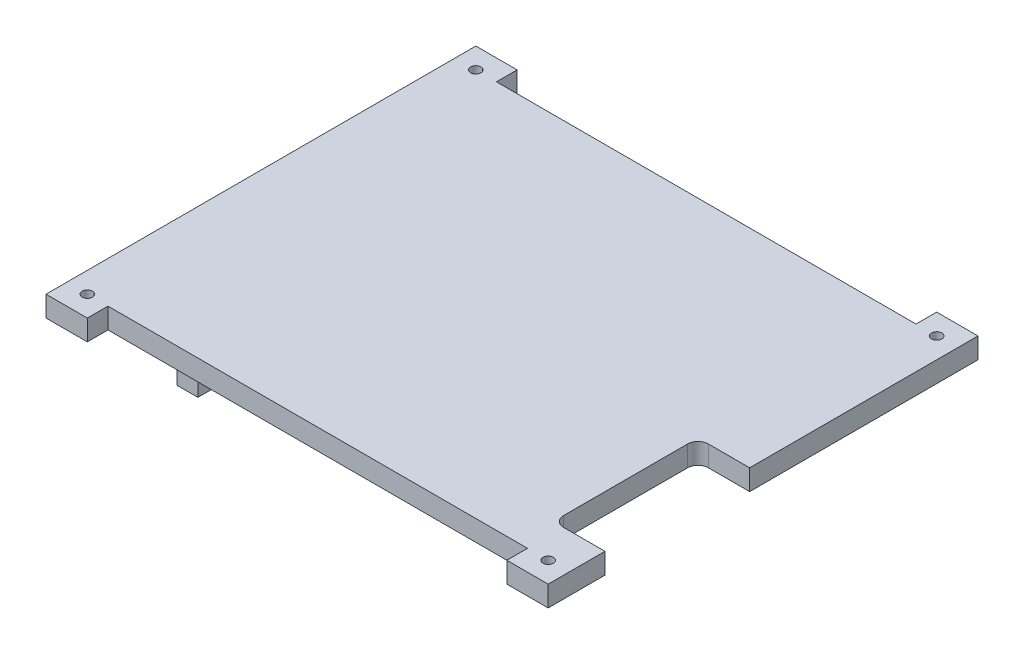
ISO-10303-21;
HEADER;
FILE_DESCRIPTION(('STEP AP214'),'2;1');
FILE_NAME('part.step','',(''),(''),'','','');
FILE_SCHEMA(('AUTOMOTIVE_DESIGN { 1 0 10303 214 1 1 1 1 }'));
ENDSEC;
DATA;
#1=APPLICATION_CONTEXT('core data for automotive mechanical design processes');
#2=APPLICATION_PROTOCOL_DEFINITION('international standard','automotive_design',2000,#1);
#3=PRODUCT_CONTEXT('',#1,'mechanical');
#4=PRODUCT('Part','Part','',(#3));
#5=PRODUCT_RELATED_PRODUCT_CATEGORY('part','',(#4));
#6=PRODUCT_DEFINITION_FORMATION('','',#4);
#7=PRODUCT_DEFINITION_CONTEXT('part definition',#1,'design');
#8=PRODUCT_DEFINITION('design','',#6,#7);
#9=PRODUCT_DEFINITION_SHAPE('','',#8);
#10=(LENGTH_UNIT() NAMED_UNIT(*) SI_UNIT(.MILLI.,.METRE.));
#11=(NAMED_UNIT(*) PLANE_ANGLE_UNIT() SI_UNIT($,.RADIAN.));
#12=(NAMED_UNIT(*) SI_UNIT($,.STERADIAN.) SOLID_ANGLE_UNIT());
#13=UNCERTAINTY_MEASURE_WITH_UNIT(LENGTH_MEASURE(1.E-05),#10,'distance_accuracy_value','');
#14=(GEOMETRIC_REPRESENTATION_CONTEXT(3) GLOBAL_UNCERTAINTY_ASSIGNED_CONTEXT((#13)) GLOBAL_UNIT_ASSIGNED_CONTEXT((#10,
#11,#12)) REPRESENTATION_CONTEXT('',''));
#15=CARTESIAN_POINT('',(0.,0.,0.));
#16=DIRECTION('',(0.,0.,1.));
#17=DIRECTION('',(1.,0.,0.));
#18=AXIS2_PLACEMENT_3D('',#15,#16,#17);
#19=CARTESIAN_POINT('',(0.,-1346.90837694455,0.));
#20=DIRECTION('',(0.,1.,0.));
#21=DIRECTION('',(0.,0.,1.));
#22=AXIS2_PLACEMENT_3D('',#19,#20,#21);
#23=PLANE('',#22);
#24=CARTESIAN_POINT('',(-1070.43227351419,-1346.90837694455,-1964.4));
#25=DIRECTION('',(0.,1.,0.));
#26=DIRECTION('',(0.,0.,1.));
#27=AXIS2_PLACEMENT_3D('',#24,#25,#26);
#28=CIRCLE('',#27,0.499999999999993);
#29=CARTESIAN_POINT('',(-1070.43227351419,-1346.90837694455,-1963.9));
#30=VERTEX_POINT('',#29);
#31=EDGE_CURVE('E241',#30,#30,#28,.T.);
#32=ORIENTED_EDGE('',*,*,#31,.T.);
#33=EDGE_LOOP('',(#32));
#34=FACE_BOUND('',#33,.T.);
#35=CARTESIAN_POINT('',(-1025.83227351419,-1346.90837694455,-1964.4));
#36=DIRECTION('',(0.,1.,0.));
#37=DIRECTION('',(0.,0.,1.));
#38=AXIS2_PLACEMENT_3D('',#35,#36,#37);
#39=CIRCLE('',#38,0.499999999999993);
#40=CARTESIAN_POINT('',(-1025.83227351419,-1346.90837694455,-1963.9));
#41=VERTEX_POINT('',#40);
#42=EDGE_CURVE('E310',#41,#41,#39,.T.);
#43=ORIENTED_EDGE('',*,*,#42,.T.);
#44=EDGE_LOOP('',(#43));
#45=FACE_BOUND('',#44,.T.);
#46=CARTESIAN_POINT('',(-1025.83227351419,-1346.90837694455,-2002.));
#47=DIRECTION('',(0.,1.,0.));
#48=DIRECTION('',(0.,0.,1.));
#49=AXIS2_PLACEMENT_3D('',#46,#47,#48);
#50=CIRCLE('',#49,0.499999999999999);
#51=CARTESIAN_POINT('',(-1025.83227351419,-1346.90837694455,-2001.5));
#52=VERTEX_POINT('',#51);
#53=EDGE_CURVE('E307',#52,#52,#50,.F.);
#54=ORIENTED_EDGE('',*,*,#53,.F.);
#55=EDGE_LOOP('',(#54));
#56=FACE_BOUND('',#55,.T.);
#57=CARTESIAN_POINT('',(-1070.43227351419,-1346.90837694455,-2002.));
#58=DIRECTION('',(0.,1.,0.));
#59=DIRECTION('',(0.,0.,1.));
#60=AXIS2_PLACEMENT_3D('',#57,#58,#59);
#61=CIRCLE('',#60,0.5);
#62=CARTESIAN_POINT('',(-1070.43227351419,-1346.90837694455,-2001.5));
#63=VERTEX_POINT('',#62);
#64=EDGE_CURVE('E304',#63,#63,#61,.F.);
#65=ORIENTED_EDGE('',*,*,#64,.F.);
#66=EDGE_LOOP('',(#65));
#67=FACE_BOUND('',#66,.T.);
#68=DIRECTION('',(-1.,0.,0.));
#69=VECTOR('',#68,1.);
#70=CARTESIAN_POINT('',(-1072.43227351419,-1346.90837694455,-1975.1));
#71=LINE('',#70,#69);
#72=CARTESIAN_POINT('',(-1070.43227351419,-1346.90837694455,-1975.1));
#73=VERTEX_POINT('',#72);
#74=CARTESIAN_POINT('',(-1072.43227351419,-1346.90837694455,-1975.1));
#75=VERTEX_POINT('',#74);
#76=EDGE_CURVE('E49',#73,#75,#71,.T.);
#77=ORIENTED_EDGE('',*,*,#76,.F.);
#78=DIRECTION('',(0.,0.,1.));
#79=VECTOR('',#78,1.);
#80=CARTESIAN_POINT('',(-1070.43227351419,-1346.90837694455,-1991.3));
#81=LINE('',#80,#79);
#82=CARTESIAN_POINT('',(-1070.43227351419,-1346.90837694455,-1991.3));
#83=VERTEX_POINT('',#82);
#84=EDGE_CURVE('E179',#83,#73,#81,.T.);
#85=ORIENTED_EDGE('',*,*,#84,.F.);
#86=DIRECTION('',(1.,0.,0.));
#87=VECTOR('',#86,1.);
#88=CARTESIAN_POINT('',(-1072.43227351419,-1346.90837694455,-1991.3));
#89=LINE('',#88,#87);
#90=CARTESIAN_POINT('',(-1072.43227351419,-1346.90837694455,-1991.3));
#91=VERTEX_POINT('',#90);
#92=EDGE_CURVE('E183',#91,#83,#89,.T.);
#93=ORIENTED_EDGE('',*,*,#92,.F.);
#94=DIRECTION('',(0.,0.,1.));
#95=VECTOR('',#94,1.);
#96=CARTESIAN_POINT('',(-1072.43227351419,-1346.90837694455,0.));
#97=LINE('',#96,#95);
#98=CARTESIAN_POINT('',(-1072.43227351419,-1346.90837694455,-2004.));
#99=VERTEX_POINT('',#98);
#100=EDGE_CURVE('E278',#99,#91,#97,.T.);
#101=ORIENTED_EDGE('',*,*,#100,.F.);
#102=DIRECTION('',(-1.,0.,0.));
#103=VECTOR('',#102,1.);
#104=CARTESIAN_POINT('',(0.,-1346.90837694455,-2004.));
#105=LINE('',#104,#103);
#106=CARTESIAN_POINT('',(-1068.43227351419,-1346.90837694455,-2004.));
#107=VERTEX_POINT('',#106);
#108=EDGE_CURVE('E302',#107,#99,#105,.T.);
#109=ORIENTED_EDGE('',*,*,#108,.F.);
#110=DIRECTION('',(0.,0.,-1.));
#111=VECTOR('',#110,1.);
#112=CARTESIAN_POINT('',(-1068.43227351419,-1346.90837694455,0.));
#113=LINE('',#112,#111);
#114=CARTESIAN_POINT('',(-1068.43227351419,-1346.90837694455,-2002.));
#115=VERTEX_POINT('',#114);
#116=EDGE_CURVE('E300',#115,#107,#113,.T.);
#117=ORIENTED_EDGE('',*,*,#116,.F.);
#118=DIRECTION('',(-1.,0.,0.));
#119=VECTOR('',#118,1.);
#120=CARTESIAN_POINT('',(0.,-1346.90837694455,-2002.));
#121=LINE('',#120,#119);
#122=CARTESIAN_POINT('',(-1027.83227351419,-1346.90837694455,-2002.));
#123=VERTEX_POINT('',#122);
#124=EDGE_CURVE('E298',#123,#115,#121,.T.);
#125=ORIENTED_EDGE('',*,*,#124,.F.);
#126=DIRECTION('',(0.,0.,1.));
#127=VECTOR('',#126,1.);
#128=CARTESIAN_POINT('',(-1027.83227351419,-1346.90837694455,0.));
#129=LINE('',#128,#127);
#130=CARTESIAN_POINT('',(-1027.83227351419,-1346.90837694455,-2004.));
#131=VERTEX_POINT('',#130);
#132=EDGE_CURVE('E296',#131,#123,#129,.T.);
#133=ORIENTED_EDGE('',*,*,#132,.F.);
#134=DIRECTION('',(-1.,0.,0.));
#135=VECTOR('',#134,1.);
#136=CARTESIAN_POINT('',(0.,-1346.90837694455,-2004.));
#137=LINE('',#136,#135);
#138=CARTESIAN_POINT('',(-1023.83227351419,-1346.90837694455,-2004.));
#139=VERTEX_POINT('',#138);
#140=EDGE_CURVE('E294',#139,#131,#137,.T.);
#141=ORIENTED_EDGE('',*,*,#140,.F.);
#142=DIRECTION('',(0.,0.,-1.));
#143=VECTOR('',#142,1.);
#144=CARTESIAN_POINT('',(-1023.83227351419,-1346.90837694455,0.));
#145=LINE('',#144,#143);
#146=CARTESIAN_POINT('',(-1023.83227351419,-1346.90837694455,-1981.9));
#147=VERTEX_POINT('',#146);
#148=EDGE_CURVE('E290',#147,#139,#145,.T.);
#149=ORIENTED_EDGE('',*,*,#148,.F.);
#150=DIRECTION('',(-1.,0.,0.));
#151=VECTOR('',#150,1.);
#152=CARTESIAN_POINT('',(0.,-1346.90837694455,-1981.9));
#153=LINE('',#152,#151);
#154=CARTESIAN_POINT('',(-1027.83227351419,-1346.90837694455,-1981.9));
#155=VERTEX_POINT('',#154);
#156=EDGE_CURVE('E221',#147,#155,#153,.T.);
#157=ORIENTED_EDGE('',*,*,#156,.T.);
#158=CARTESIAN_POINT('',(-1027.83227351419,-1346.90837694455,-1980.9));
#159=DIRECTION('',(0.,1.,0.));
#160=DIRECTION('',(0.,0.,1.));
#161=AXIS2_PLACEMENT_3D('',#158,#159,#160);
#162=CIRCLE('',#161,1.);
#163=CARTESIAN_POINT('',(-1028.83227351419,-1346.90837694455,-1980.9));
#164=VERTEX_POINT('',#163);
#165=EDGE_CURVE('E362',#155,#164,#162,.T.);
#166=ORIENTED_EDGE('',*,*,#165,.T.);
#167=DIRECTION('',(0.,0.,-1.));
#168=VECTOR('',#167,1.);
#169=CARTESIAN_POINT('',(-1028.83227351419,-1346.90837694455,0.));
#170=LINE('',#169,#168);
#171=CARTESIAN_POINT('',(-1028.83227351419,-1346.90837694455,-1968.9));
#172=VERTEX_POINT('',#171);
#173=EDGE_CURVE('E214',#172,#164,#170,.T.);
#174=ORIENTED_EDGE('',*,*,#173,.F.);
#175=CARTESIAN_POINT('',(-1027.83227351419,-1346.90837694455,-1968.9));
#176=DIRECTION('',(0.,1.,0.));
#177=DIRECTION('',(0.,0.,1.));
#178=AXIS2_PLACEMENT_3D('',#175,#176,#177);
#179=CIRCLE('',#178,1.);
#180=CARTESIAN_POINT('',(-1027.83227351419,-1346.90837694455,-1967.9));
#181=VERTEX_POINT('',#180);
#182=EDGE_CURVE('E12',#172,#181,#179,.T.);
#183=ORIENTED_EDGE('',*,*,#182,.T.);
#184=DIRECTION('',(-1.,0.,0.));
#185=VECTOR('',#184,1.);
#186=CARTESIAN_POINT('',(0.,-1346.90837694455,-1967.9));
#187=LINE('',#186,#185);
#188=CARTESIAN_POINT('',(-1023.83227351419,-1346.90837694455,-1967.9));
#189=VERTEX_POINT('',#188);
#190=EDGE_CURVE('E217',#189,#181,#187,.T.);
#191=ORIENTED_EDGE('',*,*,#190,.F.);
#192=CARTESIAN_POINT('',(-1023.83227351419,-1346.90837694455,-1962.4));
#193=VERTEX_POINT('',#192);
#194=EDGE_CURVE('E291',#193,#189,#145,.T.);
#195=ORIENTED_EDGE('',*,*,#194,.F.);
#196=DIRECTION('',(1.,0.,0.));
#197=VECTOR('',#196,1.);
#198=CARTESIAN_POINT('',(0.,-1346.90837694455,-1962.4));
#199=LINE('',#198,#197);
#200=CARTESIAN_POINT('',(-1027.83227351419,-1346.90837694455,-1962.4));
#201=VERTEX_POINT('',#200);
#202=EDGE_CURVE('E288',#201,#193,#199,.T.);
#203=ORIENTED_EDGE('',*,*,#202,.F.);
#204=DIRECTION('',(0.,0.,1.));
#205=VECTOR('',#204,1.);
#206=CARTESIAN_POINT('',(-1027.83227351419,-1346.90837694455,0.));
#207=LINE('',#206,#205);
#208=CARTESIAN_POINT('',(-1027.83227351419,-1346.90837694455,-1964.4));
#209=VERTEX_POINT('',#208);
#210=EDGE_CURVE('E286',#209,#201,#207,.T.);
#211=ORIENTED_EDGE('',*,*,#210,.F.);
#212=DIRECTION('',(1.,0.,0.));
#213=VECTOR('',#212,1.);
#214=CARTESIAN_POINT('',(0.,-1346.90837694455,-1964.4));
#215=LINE('',#214,#213);
#216=CARTESIAN_POINT('',(-1068.43227351419,-1346.90837694455,-1964.4));
#217=VERTEX_POINT('',#216);
#218=EDGE_CURVE('E284',#217,#209,#215,.T.);
#219=ORIENTED_EDGE('',*,*,#218,.F.);
#220=DIRECTION('',(0.,0.,-1.));
#221=VECTOR('',#220,1.);
#222=CARTESIAN_POINT('',(-1068.43227351419,-1346.90837694455,0.));
#223=LINE('',#222,#221);
#224=CARTESIAN_POINT('',(-1068.43227351419,-1346.90837694455,-1962.4));
#225=VERTEX_POINT('',#224);
#226=EDGE_CURVE('E282',#225,#217,#223,.T.);
#227=ORIENTED_EDGE('',*,*,#226,.F.);
#228=DIRECTION('',(1.,0.,0.));
#229=VECTOR('',#228,1.);
#230=CARTESIAN_POINT('',(0.,-1346.90837694455,-1962.4));
#231=LINE('',#230,#229);
#232=CARTESIAN_POINT('',(-1072.43227351419,-1346.90837694455,-1962.4));
#233=VERTEX_POINT('',#232);
#234=EDGE_CURVE('E280',#233,#225,#231,.T.);
#235=ORIENTED_EDGE('',*,*,#234,.F.);
#236=EDGE_CURVE('E54',#75,#233,#97,.T.);
#237=ORIENTED_EDGE('',*,*,#236,.F.);
#238=EDGE_LOOP('',(#77,#85,#93,#101,#109,#117,#125,#133,#141,#149,#157,#166,#174,#183,#191,#195,
#203,#211,#219,#227,#235,#237));
#239=FACE_BOUND('',#238,.T.);
#240=ADVANCED_FACE('F34',(#34,#45,#56,#67,#239),#23,.F.);
#241=CARTESIAN_POINT('',(-1023.83227351419,-1344.90837694455,0.));
#242=DIRECTION('',(-1.,0.,0.));
#243=DIRECTION('',(0.,0.,1.));
#244=AXIS2_PLACEMENT_3D('',#241,#242,#243);
#245=PLANE('',#244);
#246=DIRECTION('',(0.,1.,0.));
#247=VECTOR('',#246,1.);
#248=CARTESIAN_POINT('',(-1023.83227351419,-1346.90837694455,-1967.9));
#249=LINE('',#248,#247);
#250=CARTESIAN_POINT('',(-1023.83227351419,-1344.90837694455,-1967.9));
#251=VERTEX_POINT('',#250);
#252=EDGE_CURVE('E224',#189,#251,#249,.T.);
#253=ORIENTED_EDGE('',*,*,#252,.T.);
#254=DIRECTION('',(0.,0.,-1.));
#255=VECTOR('',#254,1.);
#256=CARTESIAN_POINT('',(-1023.83227351419,-1344.90837694455,0.));
#257=LINE('',#256,#255);
#258=CARTESIAN_POINT('',(-1023.83227351419,-1344.90837694455,-1962.4));
#259=VERTEX_POINT('',#258);
#260=EDGE_CURVE('E252',#259,#251,#257,.T.);
#261=ORIENTED_EDGE('',*,*,#260,.F.);
#262=DIRECTION('',(0.,-1.,0.));
#263=VECTOR('',#262,1.);
#264=CARTESIAN_POINT('',(-1023.83227351419,-1344.90837694455,-1962.4));
#265=LINE('',#264,#263);
#266=EDGE_CURVE('E332',#259,#193,#265,.T.);
#267=ORIENTED_EDGE('',*,*,#266,.T.);
#268=ORIENTED_EDGE('',*,*,#194,.T.);
#269=EDGE_LOOP('',(#253,#261,#267,#268));
#270=FACE_BOUND('',#269,.T.);
#271=ADVANCED_FACE('F382',(#270),#245,.F.);
#272=CARTESIAN_POINT('',(-1072.43227351419,-1344.90837694455,0.));
#273=DIRECTION('',(1.,0.,0.));
#274=DIRECTION('',(0.,0.,-1.));
#275=AXIS2_PLACEMENT_3D('',#272,#273,#274);
#276=PLANE('',#275);
#277=ORIENTED_EDGE('',*,*,#100,.T.);
#278=DIRECTION('',(0.,1.,0.));
#279=VECTOR('',#278,1.);
#280=CARTESIAN_POINT('',(-1072.43227351419,-1383.23136686674,-1991.3));
#281=LINE('',#280,#279);
#282=CARTESIAN_POINT('',(-1072.43227351419,-1358.90837694455,-1991.3));
#283=VERTEX_POINT('',#282);
#284=EDGE_CURVE('E195',#283,#91,#281,.T.);
#285=ORIENTED_EDGE('',*,*,#284,.F.);
#286=DIRECTION('',(0.,0.,1.));
#287=VECTOR('',#286,1.);
#288=CARTESIAN_POINT('',(-1072.43227351419,-1358.90837694455,-1991.3));
#289=LINE('',#288,#287);
#290=CARTESIAN_POINT('',(-1072.43227351419,-1358.90837694455,-1975.1));
#291=VERTEX_POINT('',#290);
#292=EDGE_CURVE('E203',#283,#291,#289,.T.);
#293=ORIENTED_EDGE('',*,*,#292,.T.);
#294=DIRECTION('',(0.,1.,0.));
#295=VECTOR('',#294,1.);
#296=CARTESIAN_POINT('',(-1072.43227351419,-1383.23136686674,-1975.1));
#297=LINE('',#296,#295);
#298=EDGE_CURVE('E207',#291,#75,#297,.T.);
#299=ORIENTED_EDGE('',*,*,#298,.T.);
#300=ORIENTED_EDGE('',*,*,#236,.T.);
#301=DIRECTION('',(0.,-1.,0.));
#302=VECTOR('',#301,1.);
#303=CARTESIAN_POINT('',(-1072.43227351419,-1344.90837694455,-1962.4));
#304=LINE('',#303,#302);
#305=CARTESIAN_POINT('',(-1072.43227351419,-1344.90837694455,-1962.4));
#306=VERTEX_POINT('',#305);
#307=EDGE_CURVE('E347',#306,#233,#304,.T.);
#308=ORIENTED_EDGE('',*,*,#307,.F.);
#309=DIRECTION('',(0.,0.,1.));
#310=VECTOR('',#309,1.);
#311=CARTESIAN_POINT('',(-1072.43227351419,-1344.90837694455,0.));
#312=LINE('',#311,#310);
#313=CARTESIAN_POINT('',(-1072.43227351419,-1344.90837694455,-2004.));
#314=VERTEX_POINT('',#313);
#315=EDGE_CURVE('E237',#314,#306,#312,.T.);
#316=ORIENTED_EDGE('',*,*,#315,.F.);
#317=DIRECTION('',(0.,-1.,0.));
#318=VECTOR('',#317,1.);
#319=CARTESIAN_POINT('',(-1072.43227351419,-1344.90837694455,-2004.));
#320=LINE('',#319,#318);
#321=EDGE_CURVE('E277',#314,#99,#320,.T.);
#322=ORIENTED_EDGE('',*,*,#321,.T.);
#323=EDGE_LOOP('',(#277,#285,#293,#299,#300,#308,#316,#322));
#324=FACE_BOUND('',#323,.T.);
#325=ADVANCED_FACE('F409',(#324),#276,.F.);
#326=CARTESIAN_POINT('',(0.,-1344.90837694455,-1962.4));
#327=DIRECTION('',(0.,0.,-1.));
#328=DIRECTION('',(-1.,0.,0.));
#329=AXIS2_PLACEMENT_3D('',#326,#327,#328);
#330=PLANE('',#329);
#331=ORIENTED_EDGE('',*,*,#234,.T.);
#332=DIRECTION('',(0.,-1.,0.));
#333=VECTOR('',#332,1.);
#334=CARTESIAN_POINT('',(-1068.43227351419,-1344.90837694455,-1962.4));
#335=LINE('',#334,#333);
#336=CARTESIAN_POINT('',(-1068.43227351419,-1344.90837694455,-1962.4));
#337=VERTEX_POINT('',#336);
#338=EDGE_CURVE('E344',#337,#225,#335,.T.);
#339=ORIENTED_EDGE('',*,*,#338,.F.);
#340=DIRECTION('',(1.,0.,0.));
#341=VECTOR('',#340,1.);
#342=CARTESIAN_POINT('',(0.,-1344.90837694455,-1962.4));
#343=LINE('',#342,#341);
#344=EDGE_CURVE('E240',#306,#337,#343,.T.);
#345=ORIENTED_EDGE('',*,*,#344,.F.);
#346=ORIENTED_EDGE('',*,*,#307,.T.);
#347=EDGE_LOOP('',(#331,#339,#345,#346));
#348=FACE_BOUND('',#347,.T.);
#349=ADVANCED_FACE('F406',(#348),#330,.F.);
#350=CARTESIAN_POINT('',(-1068.43227351419,-1344.90837694455,0.));
#351=DIRECTION('',(-1.,0.,0.));
#352=DIRECTION('',(0.,0.,1.));
#353=AXIS2_PLACEMENT_3D('',#350,#351,#352);
#354=PLANE('',#353);
#355=ORIENTED_EDGE('',*,*,#226,.T.);
#356=DIRECTION('',(0.,-1.,0.));
#357=VECTOR('',#356,1.);
#358=CARTESIAN_POINT('',(-1068.43227351419,-1344.90837694455,-1964.4));
#359=LINE('',#358,#357);
#360=CARTESIAN_POINT('',(-1068.43227351419,-1344.90837694455,-1964.4));
#361=VERTEX_POINT('',#360);
#362=EDGE_CURVE('E341',#361,#217,#359,.T.);
#363=ORIENTED_EDGE('',*,*,#362,.F.);
#364=DIRECTION('',(0.,0.,-1.));
#365=VECTOR('',#364,1.);
#366=CARTESIAN_POINT('',(-1068.43227351419,-1344.90837694455,0.));
#367=LINE('',#366,#365);
#368=EDGE_CURVE('E243',#337,#361,#367,.T.);
#369=ORIENTED_EDGE('',*,*,#368,.F.);
#370=ORIENTED_EDGE('',*,*,#338,.T.);
#371=EDGE_LOOP('',(#355,#363,#369,#370));
#372=FACE_BOUND('',#371,.T.);
#373=ADVANCED_FACE('F402',(#372),#354,.F.);
#374=CARTESIAN_POINT('',(0.,-1344.90837694455,-1964.4));
#375=DIRECTION('',(0.,0.,-1.));
#376=DIRECTION('',(-1.,0.,0.));
#377=AXIS2_PLACEMENT_3D('',#374,#375,#376);
#378=PLANE('',#377);
#379=ORIENTED_EDGE('',*,*,#218,.T.);
#380=DIRECTION('',(0.,-1.,0.));
#381=VECTOR('',#380,1.);
#382=CARTESIAN_POINT('',(-1027.83227351419,-1344.90837694455,-1964.4));
#383=LINE('',#382,#381);
#384=CARTESIAN_POINT('',(-1027.83227351419,-1344.90837694455,-1964.4));
#385=VERTEX_POINT('',#384);
#386=EDGE_CURVE('E338',#385,#209,#383,.T.);
#387=ORIENTED_EDGE('',*,*,#386,.F.);
#388=DIRECTION('',(1.,0.,0.));
#389=VECTOR('',#388,1.);
#390=CARTESIAN_POINT('',(0.,-1344.90837694455,-1964.4));
#391=LINE('',#390,#389);
#392=EDGE_CURVE('E245',#361,#385,#391,.T.);
#393=ORIENTED_EDGE('',*,*,#392,.F.);
#394=ORIENTED_EDGE('',*,*,#362,.T.);
#395=EDGE_LOOP('',(#379,#387,#393,#394));
#396=FACE_BOUND('',#395,.T.);
#397=ADVANCED_FACE('F398',(#396),#378,.F.);
#398=CARTESIAN_POINT('',(-1027.83227351419,-1344.90837694455,0.));
#399=DIRECTION('',(1.,0.,0.));
#400=DIRECTION('',(0.,0.,-1.));
#401=AXIS2_PLACEMENT_3D('',#398,#399,#400);
#402=PLANE('',#401);
#403=ORIENTED_EDGE('',*,*,#210,.T.);
#404=DIRECTION('',(0.,-1.,0.));
#405=VECTOR('',#404,1.);
#406=CARTESIAN_POINT('',(-1027.83227351419,-1344.90837694455,-1962.4));
#407=LINE('',#406,#405);
#408=CARTESIAN_POINT('',(-1027.83227351419,-1344.90837694455,-1962.4));
#409=VERTEX_POINT('',#408);
#410=EDGE_CURVE('E335',#409,#201,#407,.T.);
#411=ORIENTED_EDGE('',*,*,#410,.F.);
#412=DIRECTION('',(0.,0.,1.));
#413=VECTOR('',#412,1.);
#414=CARTESIAN_POINT('',(-1027.83227351419,-1344.90837694455,0.));
#415=LINE('',#414,#413);
#416=EDGE_CURVE('E247',#385,#409,#415,.T.);
#417=ORIENTED_EDGE('',*,*,#416,.F.);
#418=ORIENTED_EDGE('',*,*,#386,.T.);
#419=EDGE_LOOP('',(#403,#411,#417,#418));
#420=FACE_BOUND('',#419,.T.);
#421=ADVANCED_FACE('F394',(#420),#402,.F.);
#422=CARTESIAN_POINT('',(0.,-1344.90837694455,-1962.4));
#423=DIRECTION('',(0.,0.,-1.));
#424=DIRECTION('',(-1.,0.,0.));
#425=AXIS2_PLACEMENT_3D('',#422,#423,#424);
#426=PLANE('',#425);
#427=ORIENTED_EDGE('',*,*,#202,.T.);
#428=ORIENTED_EDGE('',*,*,#266,.F.);
#429=DIRECTION('',(1.,0.,0.));
#430=VECTOR('',#429,1.);
#431=CARTESIAN_POINT('',(0.,-1344.90837694455,-1962.4));
#432=LINE('',#431,#430);
#433=EDGE_CURVE('E249',#409,#259,#432,.T.);
#434=ORIENTED_EDGE('',*,*,#433,.F.);
#435=ORIENTED_EDGE('',*,*,#410,.T.);
#436=EDGE_LOOP('',(#427,#428,#434,#435));
#437=FACE_BOUND('',#436,.T.);
#438=ADVANCED_FACE('F388',(#437),#426,.F.);
#439=CARTESIAN_POINT('',(-1023.83227351419,-1344.90837694455,-1981.9));
#440=VERTEX_POINT('',#439);
#441=CARTESIAN_POINT('',(-1023.83227351419,-1344.90837694455,-2004.));
#442=VERTEX_POINT('',#441);
#443=EDGE_CURVE('E251',#440,#442,#257,.T.);
#444=ORIENTED_EDGE('',*,*,#443,.F.);
#445=DIRECTION('',(0.,1.,0.));
#446=VECTOR('',#445,1.);
#447=CARTESIAN_POINT('',(-1023.83227351419,-1346.90837694455,-1981.9));
#448=LINE('',#447,#446);
#449=EDGE_CURVE('E233',#147,#440,#448,.T.);
#450=ORIENTED_EDGE('',*,*,#449,.F.);
#451=ORIENTED_EDGE('',*,*,#148,.T.);
#452=DIRECTION('',(0.,-1.,0.));
#453=VECTOR('',#452,1.);
#454=CARTESIAN_POINT('',(-1023.83227351419,-1344.90837694455,-2004.));
#455=LINE('',#454,#453);
#456=EDGE_CURVE('E329',#442,#139,#455,.T.);
#457=ORIENTED_EDGE('',*,*,#456,.F.);
#458=EDGE_LOOP('',(#444,#450,#451,#457));
#459=FACE_BOUND('',#458,.T.);
#460=ADVANCED_FACE('F447',(#459),#245,.F.);
#461=CARTESIAN_POINT('',(0.,-1344.90837694455,-2004.));
#462=DIRECTION('',(0.,0.,1.));
#463=DIRECTION('',(1.,0.,0.));
#464=AXIS2_PLACEMENT_3D('',#461,#462,#463);
#465=PLANE('',#464);
#466=ORIENTED_EDGE('',*,*,#140,.T.);
#467=DIRECTION('',(0.,-1.,0.));
#468=VECTOR('',#467,1.);
#469=CARTESIAN_POINT('',(-1027.83227351419,-1344.90837694455,-2004.));
#470=LINE('',#469,#468);
#471=CARTESIAN_POINT('',(-1027.83227351419,-1344.90837694455,-2004.));
#472=VERTEX_POINT('',#471);
#473=EDGE_CURVE('E326',#472,#131,#470,.T.);
#474=ORIENTED_EDGE('',*,*,#473,.F.);
#475=DIRECTION('',(-1.,0.,0.));
#476=VECTOR('',#475,1.);
#477=CARTESIAN_POINT('',(0.,-1344.90837694455,-2004.));
#478=LINE('',#477,#476);
#479=EDGE_CURVE('E255',#442,#472,#478,.T.);
#480=ORIENTED_EDGE('',*,*,#479,.F.);
#481=ORIENTED_EDGE('',*,*,#456,.T.);
#482=EDGE_LOOP('',(#466,#474,#480,#481));
#483=FACE_BOUND('',#482,.T.);
#484=ADVANCED_FACE('F443',(#483),#465,.F.);
#485=CARTESIAN_POINT('',(-1027.83227351419,-1344.90837694455,0.));
#486=DIRECTION('',(1.,0.,0.));
#487=DIRECTION('',(0.,0.,-1.));
#488=AXIS2_PLACEMENT_3D('',#485,#486,#487);
#489=PLANE('',#488);
#490=ORIENTED_EDGE('',*,*,#132,.T.);
#491=DIRECTION('',(0.,-1.,0.));
#492=VECTOR('',#491,1.);
#493=CARTESIAN_POINT('',(-1027.83227351419,-1344.90837694455,-2002.));
#494=LINE('',#493,#492);
#495=CARTESIAN_POINT('',(-1027.83227351419,-1344.90837694455,-2002.));
#496=VERTEX_POINT('',#495);
#497=EDGE_CURVE('E323',#496,#123,#494,.T.);
#498=ORIENTED_EDGE('',*,*,#497,.F.);
#499=DIRECTION('',(0.,0.,1.));
#500=VECTOR('',#499,1.);
#501=CARTESIAN_POINT('',(-1027.83227351419,-1344.90837694455,0.));
#502=LINE('',#501,#500);
#503=EDGE_CURVE('E257',#472,#496,#502,.T.);
#504=ORIENTED_EDGE('',*,*,#503,.F.);
#505=ORIENTED_EDGE('',*,*,#473,.T.);
#506=EDGE_LOOP('',(#490,#498,#504,#505));
#507=FACE_BOUND('',#506,.T.);
#508=ADVANCED_FACE('F438',(#507),#489,.F.);
#509=CARTESIAN_POINT('',(0.,-1344.90837694455,-2002.));
#510=DIRECTION('',(0.,0.,1.));
#511=DIRECTION('',(1.,0.,0.));
#512=AXIS2_PLACEMENT_3D('',#509,#510,#511);
#513=PLANE('',#512);
#514=ORIENTED_EDGE('',*,*,#124,.T.);
#515=DIRECTION('',(0.,-1.,0.));
#516=VECTOR('',#515,1.);
#517=CARTESIAN_POINT('',(-1068.43227351419,-1344.90837694455,-2002.));
#518=LINE('',#517,#516);
#519=CARTESIAN_POINT('',(-1068.43227351419,-1344.90837694455,-2002.));
#520=VERTEX_POINT('',#519);
#521=EDGE_CURVE('E320',#520,#115,#518,.T.);
#522=ORIENTED_EDGE('',*,*,#521,.F.);
#523=DIRECTION('',(-1.,0.,0.));
#524=VECTOR('',#523,1.);
#525=CARTESIAN_POINT('',(0.,-1344.90837694455,-2002.));
#526=LINE('',#525,#524);
#527=EDGE_CURVE('E259',#496,#520,#526,.T.);
#528=ORIENTED_EDGE('',*,*,#527,.F.);
#529=ORIENTED_EDGE('',*,*,#497,.T.);
#530=EDGE_LOOP('',(#514,#522,#528,#529));
#531=FACE_BOUND('',#530,.T.);
#532=ADVANCED_FACE('F432',(#531),#513,.F.);
#533=CARTESIAN_POINT('',(-1068.43227351419,-1344.90837694455,0.));
#534=DIRECTION('',(-1.,0.,0.));
#535=DIRECTION('',(0.,0.,1.));
#536=AXIS2_PLACEMENT_3D('',#533,#534,#535);
#537=PLANE('',#536);
#538=ORIENTED_EDGE('',*,*,#116,.T.);
#539=DIRECTION('',(0.,-1.,0.));
#540=VECTOR('',#539,1.);
#541=CARTESIAN_POINT('',(-1068.43227351419,-1344.90837694455,-2004.));
#542=LINE('',#541,#540);
#543=CARTESIAN_POINT('',(-1068.43227351419,-1344.90837694455,-2004.));
#544=VERTEX_POINT('',#543);
#545=EDGE_CURVE('E317',#544,#107,#542,.T.);
#546=ORIENTED_EDGE('',*,*,#545,.F.);
#547=DIRECTION('',(0.,0.,-1.));
#548=VECTOR('',#547,1.);
#549=CARTESIAN_POINT('',(-1068.43227351419,-1344.90837694455,0.));
#550=LINE('',#549,#548);
#551=EDGE_CURVE('E261',#520,#544,#550,.T.);
#552=ORIENTED_EDGE('',*,*,#551,.F.);
#553=ORIENTED_EDGE('',*,*,#521,.T.);
#554=EDGE_LOOP('',(#538,#546,#552,#553));
#555=FACE_BOUND('',#554,.T.);
#556=ADVANCED_FACE('F428',(#555),#537,.F.);
#557=CARTESIAN_POINT('',(-1025.83227351419,-1344.90837694455,-1964.4));
#558=DIRECTION('',(0.,-1.,0.));
#559=DIRECTION('',(0.,0.,-1.));
#560=AXIS2_PLACEMENT_3D('',#557,#558,#559);
#561=CYLINDRICAL_SURFACE('',#560,0.499999999999993);
#562=CARTESIAN_POINT('',(-1025.83227351419,-1344.90837694455,-1964.4));
#563=DIRECTION('',(0.,1.,0.));
#564=DIRECTION('',(0.,0.,1.));
#565=AXIS2_PLACEMENT_3D('',#562,#563,#564);
#566=CIRCLE('',#565,0.499999999999993);
#567=CARTESIAN_POINT('',(-1025.83227351419,-1344.90837694455,-1963.9));
#568=VERTEX_POINT('',#567);
#569=EDGE_CURVE('E271',#568,#568,#566,.T.);
#570=ORIENTED_EDGE('',*,*,#569,.T.);
#571=EDGE_LOOP('',(#570));
#572=FACE_BOUND('',#571,.T.);
#573=ORIENTED_EDGE('',*,*,#42,.F.);
#574=EDGE_LOOP('',(#573));
#575=FACE_BOUND('',#574,.T.);
#576=ADVANCED_FACE('F478',(#572,#575),#561,.F.);
#577=CARTESIAN_POINT('',(-1025.83227351419,-1344.90837694455,-2002.));
#578=DIRECTION('',(0.,-1.,0.));
#579=DIRECTION('',(0.,0.,-1.));
#580=AXIS2_PLACEMENT_3D('',#577,#578,#579);
#581=CYLINDRICAL_SURFACE('',#580,0.499999999999999);
#582=CARTESIAN_POINT('',(-1025.83227351419,-1344.90837694455,-2002.));
#583=DIRECTION('',(0.,1.,0.));
#584=DIRECTION('',(0.,0.,1.));
#585=AXIS2_PLACEMENT_3D('',#582,#583,#584);
#586=CIRCLE('',#585,0.499999999999999);
#587=CARTESIAN_POINT('',(-1025.83227351419,-1344.90837694455,-2001.5));
#588=VERTEX_POINT('',#587);
#589=EDGE_CURVE('E268',#588,#588,#586,.F.);
#590=ORIENTED_EDGE('',*,*,#589,.F.);
#591=EDGE_LOOP('',(#590));
#592=FACE_BOUND('',#591,.T.);
#593=ORIENTED_EDGE('',*,*,#53,.T.);
#594=EDGE_LOOP('',(#593));
#595=FACE_BOUND('',#594,.T.);
#596=ADVANCED_FACE('F481',(#592,#595),#581,.F.);
#597=CARTESIAN_POINT('',(-1070.43227351419,-1344.90837694455,-2002.));
#598=DIRECTION('',(0.,-1.,0.));
#599=DIRECTION('',(0.,0.,-1.));
#600=AXIS2_PLACEMENT_3D('',#597,#598,#599);
#601=CYLINDRICAL_SURFACE('',#600,0.5);
#602=CARTESIAN_POINT('',(-1070.43227351419,-1344.90837694455,-2002.));
#603=DIRECTION('',(0.,1.,0.));
#604=DIRECTION('',(0.,0.,1.));
#605=AXIS2_PLACEMENT_3D('',#602,#603,#604);
#606=CIRCLE('',#605,0.5);
#607=CARTESIAN_POINT('',(-1070.43227351419,-1344.90837694455,-2001.5));
#608=VERTEX_POINT('',#607);
#609=EDGE_CURVE('E265',#608,#608,#606,.F.);
#610=ORIENTED_EDGE('',*,*,#609,.F.);
#611=EDGE_LOOP('',(#610));
#612=FACE_BOUND('',#611,.T.);
#613=ORIENTED_EDGE('',*,*,#64,.T.);
#614=EDGE_LOOP('',(#613));
#615=FACE_BOUND('',#614,.T.);
#616=ADVANCED_FACE('F485',(#612,#615),#601,.F.);
#617=CARTESIAN_POINT('',(0.,-1344.90837694455,-2004.));
#618=DIRECTION('',(0.,0.,1.));
#619=DIRECTION('',(1.,0.,0.));
#620=AXIS2_PLACEMENT_3D('',#617,#618,#619);
#621=PLANE('',#620);
#622=ORIENTED_EDGE('',*,*,#108,.T.);
#623=ORIENTED_EDGE('',*,*,#321,.F.);
#624=DIRECTION('',(-1.,0.,0.));
#625=VECTOR('',#624,1.);
#626=CARTESIAN_POINT('',(0.,-1344.90837694455,-2004.));
#627=LINE('',#626,#625);
#628=EDGE_CURVE('E263',#544,#314,#627,.T.);
#629=ORIENTED_EDGE('',*,*,#628,.F.);
#630=ORIENTED_EDGE('',*,*,#545,.T.);
#631=EDGE_LOOP('',(#622,#623,#629,#630));
#632=FACE_BOUND('',#631,.T.);
#633=ADVANCED_FACE('F423',(#632),#621,.F.);
#634=CARTESIAN_POINT('',(-1070.43227351419,-1344.90837694455,-1964.4));
#635=DIRECTION('',(0.,-1.,0.));
#636=DIRECTION('',(0.,0.,-1.));
#637=AXIS2_PLACEMENT_3D('',#634,#635,#636);
#638=CYLINDRICAL_SURFACE('',#637,0.499999999999993);
#639=CARTESIAN_POINT('',(-1070.43227351419,-1344.90837694455,-1964.4));
#640=DIRECTION('',(0.,1.,0.));
#641=DIRECTION('',(0.,0.,1.));
#642=AXIS2_PLACEMENT_3D('',#639,#640,#641);
#643=CIRCLE('',#642,0.499999999999993);
#644=CARTESIAN_POINT('',(-1070.43227351419,-1344.90837694455,-1963.9));
#645=VERTEX_POINT('',#644);
#646=EDGE_CURVE('E274',#645,#645,#643,.T.);
#647=ORIENTED_EDGE('',*,*,#646,.T.);
#648=EDGE_LOOP('',(#647));
#649=FACE_BOUND('',#648,.T.);
#650=ORIENTED_EDGE('',*,*,#31,.F.);
#651=EDGE_LOOP('',(#650));
#652=FACE_BOUND('',#651,.T.);
#653=ADVANCED_FACE('F474',(#649,#652),#638,.F.);
#654=CARTESIAN_POINT('',(0.,-1344.90837694455,0.));
#655=DIRECTION('',(0.,1.,0.));
#656=DIRECTION('',(0.,0.,1.));
#657=AXIS2_PLACEMENT_3D('',#654,#655,#656);
#658=PLANE('',#657);
#659=DIRECTION('',(-1.,0.,0.));
#660=VECTOR('',#659,1.);
#661=CARTESIAN_POINT('',(0.,-1344.90837694455,-1981.9));
#662=LINE('',#661,#660);
#663=CARTESIAN_POINT('',(-1027.83227351419,-1344.90837694455,-1981.9));
#664=VERTEX_POINT('',#663);
#665=EDGE_CURVE('E218',#440,#664,#662,.T.);
#666=ORIENTED_EDGE('',*,*,#665,.F.);
#667=ORIENTED_EDGE('',*,*,#443,.T.);
#668=ORIENTED_EDGE('',*,*,#479,.T.);
#669=ORIENTED_EDGE('',*,*,#503,.T.);
#670=ORIENTED_EDGE('',*,*,#527,.T.);
#671=ORIENTED_EDGE('',*,*,#551,.T.);
#672=ORIENTED_EDGE('',*,*,#628,.T.);
#673=ORIENTED_EDGE('',*,*,#315,.T.);
#674=ORIENTED_EDGE('',*,*,#344,.T.);
#675=ORIENTED_EDGE('',*,*,#368,.T.);
#676=ORIENTED_EDGE('',*,*,#392,.T.);
#677=ORIENTED_EDGE('',*,*,#416,.T.);
#678=ORIENTED_EDGE('',*,*,#433,.T.);
#679=ORIENTED_EDGE('',*,*,#260,.T.);
#680=DIRECTION('',(-1.,0.,0.));
#681=VECTOR('',#680,1.);
#682=CARTESIAN_POINT('',(0.,-1344.90837694455,-1967.9));
#683=LINE('',#682,#681);
#684=CARTESIAN_POINT('',(-1027.83227351419,-1344.90837694455,-1967.9));
#685=VERTEX_POINT('',#684);
#686=EDGE_CURVE('E228',#251,#685,#683,.T.);
#687=ORIENTED_EDGE('',*,*,#686,.T.);
#688=CARTESIAN_POINT('',(-1027.83227351419,-1344.90837694455,-1968.9));
#689=DIRECTION('',(0.,1.,0.));
#690=DIRECTION('',(0.,0.,1.));
#691=AXIS2_PLACEMENT_3D('',#688,#689,#690);
#692=CIRCLE('',#691,1.);
#693=CARTESIAN_POINT('',(-1028.83227351419,-1344.90837694455,-1968.9));
#694=VERTEX_POINT('',#693);
#695=EDGE_CURVE('E42',#685,#694,#692,.F.);
#696=ORIENTED_EDGE('',*,*,#695,.T.);
#697=DIRECTION('',(0.,0.,-1.));
#698=VECTOR('',#697,1.);
#699=CARTESIAN_POINT('',(-1028.83227351419,-1344.90837694455,0.));
#700=LINE('',#699,#698);
#701=CARTESIAN_POINT('',(-1028.83227351419,-1344.90837694455,-1980.9));
#702=VERTEX_POINT('',#701);
#703=EDGE_CURVE('E225',#694,#702,#700,.T.);
#704=ORIENTED_EDGE('',*,*,#703,.T.);
#705=CARTESIAN_POINT('',(-1027.83227351419,-1344.90837694455,-1980.9));
#706=DIRECTION('',(0.,1.,0.));
#707=DIRECTION('',(0.,0.,1.));
#708=AXIS2_PLACEMENT_3D('',#705,#706,#707);
#709=CIRCLE('',#708,1.);
#710=EDGE_CURVE('E360',#702,#664,#709,.F.);
#711=ORIENTED_EDGE('',*,*,#710,.T.);
#712=EDGE_LOOP('',(#666,#667,#668,#669,#670,#671,#672,#673,#674,#675,#676,#677,#678,#679,#687,
#696,#704,#711));
#713=FACE_BOUND('',#712,.T.);
#714=ORIENTED_EDGE('',*,*,#609,.T.);
#715=EDGE_LOOP('',(#714));
#716=FACE_BOUND('',#715,.T.);
#717=ORIENTED_EDGE('',*,*,#589,.T.);
#718=EDGE_LOOP('',(#717));
#719=FACE_BOUND('',#718,.T.);
#720=ORIENTED_EDGE('',*,*,#569,.F.);
#721=EDGE_LOOP('',(#720));
#722=FACE_BOUND('',#721,.T.);
#723=ORIENTED_EDGE('',*,*,#646,.F.);
#724=EDGE_LOOP('',(#723));
#725=FACE_BOUND('',#724,.T.);
#726=ADVANCED_FACE('F366',(#713,#716,#719,#722,#725),#658,.T.);
#727=CARTESIAN_POINT('',(-1028.83227351419,-1346.90837694455,0.));
#728=DIRECTION('',(1.,0.,0.));
#729=DIRECTION('',(0.,0.,-1.));
#730=AXIS2_PLACEMENT_3D('',#727,#728,#729);
#731=PLANE('',#730);
#732=ORIENTED_EDGE('',*,*,#173,.T.);
#733=DIRECTION('',(0.,1.,0.));
#734=VECTOR('',#733,1.);
#735=CARTESIAN_POINT('',(-1028.83227351419,-1346.90837694455,-1980.9));
#736=LINE('',#735,#734);
#737=EDGE_CURVE('E352',#164,#702,#736,.T.);
#738=ORIENTED_EDGE('',*,*,#737,.T.);
#739=ORIENTED_EDGE('',*,*,#703,.F.);
#740=DIRECTION('',(0.,1.,0.));
#741=VECTOR('',#740,1.);
#742=CARTESIAN_POINT('',(-1028.83227351419,-1346.90837694455,-1968.9));
#743=LINE('',#742,#741);
#744=EDGE_CURVE('E350',#694,#172,#743,.F.);
#745=ORIENTED_EDGE('',*,*,#744,.T.);
#746=EDGE_LOOP('',(#732,#738,#739,#745));
#747=FACE_BOUND('',#746,.T.);
#748=ADVANCED_FACE('F372',(#747),#731,.T.);
#749=CARTESIAN_POINT('',(0.,-1346.90837694455,-1981.9));
#750=DIRECTION('',(0.,0.,-1.));
#751=DIRECTION('',(-1.,0.,0.));
#752=AXIS2_PLACEMENT_3D('',#749,#750,#751);
#753=PLANE('',#752);
#754=ORIENTED_EDGE('',*,*,#665,.T.);
#755=DIRECTION('',(0.,1.,0.));
#756=VECTOR('',#755,1.);
#757=CARTESIAN_POINT('',(-1027.83227351419,-1346.90837694455,-1981.9));
#758=LINE('',#757,#756);
#759=EDGE_CURVE('E355',#664,#155,#758,.F.);
#760=ORIENTED_EDGE('',*,*,#759,.T.);
#761=ORIENTED_EDGE('',*,*,#156,.F.);
#762=ORIENTED_EDGE('',*,*,#449,.T.);
#763=EDGE_LOOP('',(#754,#760,#761,#762));
#764=FACE_BOUND('',#763,.T.);
#765=ADVANCED_FACE('F454',(#764),#753,.F.);
#766=CARTESIAN_POINT('',(0.,-1346.90837694455,-1967.9));
#767=DIRECTION('',(0.,0.,-1.));
#768=DIRECTION('',(-1.,0.,0.));
#769=AXIS2_PLACEMENT_3D('',#766,#767,#768);
#770=PLANE('',#769);
#771=ORIENTED_EDGE('',*,*,#190,.T.);
#772=DIRECTION('',(0.,1.,0.));
#773=VECTOR('',#772,1.);
#774=CARTESIAN_POINT('',(-1027.83227351419,-1344.90837694455,-1967.9));
#775=LINE('',#774,#773);
#776=EDGE_CURVE('E357',#181,#685,#775,.T.);
#777=ORIENTED_EDGE('',*,*,#776,.T.);
#778=ORIENTED_EDGE('',*,*,#686,.F.);
#779=ORIENTED_EDGE('',*,*,#252,.F.);
#780=EDGE_LOOP('',(#771,#777,#778,#779));
#781=FACE_BOUND('',#780,.T.);
#782=ADVANCED_FACE('F379',(#781),#770,.T.);
#783=CARTESIAN_POINT('',(-1027.83227351419,-1346.90837694455,-1980.9));
#784=DIRECTION('',(0.,1.,0.));
#785=DIRECTION('',(0.,0.,1.));
#786=AXIS2_PLACEMENT_3D('',#783,#784,#785);
#787=CYLINDRICAL_SURFACE('',#786,1.);
#788=ORIENTED_EDGE('',*,*,#165,.F.);
#789=ORIENTED_EDGE('',*,*,#759,.F.);
#790=ORIENTED_EDGE('',*,*,#710,.F.);
#791=ORIENTED_EDGE('',*,*,#737,.F.);
#792=EDGE_LOOP('',(#788,#789,#790,#791));
#793=FACE_BOUND('',#792,.T.);
#794=ADVANCED_FACE('F453',(#793),#787,.F.);
#795=CARTESIAN_POINT('',(-1027.83227351419,-1346.90837694455,-1968.9));
#796=DIRECTION('',(0.,-1.,0.));
#797=DIRECTION('',(0.,0.,-1.));
#798=AXIS2_PLACEMENT_3D('',#795,#796,#797);
#799=CYLINDRICAL_SURFACE('',#798,1.);
#800=ORIENTED_EDGE('',*,*,#182,.F.);
#801=ORIENTED_EDGE('',*,*,#744,.F.);
#802=ORIENTED_EDGE('',*,*,#695,.F.);
#803=ORIENTED_EDGE('',*,*,#776,.F.);
#804=EDGE_LOOP('',(#800,#801,#802,#803));
#805=FACE_BOUND('',#804,.T.);
#806=ADVANCED_FACE('F36',(#805),#799,.F.);
#807=CARTESIAN_POINT('',(-1072.43227351419,-1383.23136686674,-1975.1));
#808=DIRECTION('',(0.,0.,-1.));
#809=DIRECTION('',(-1.,0.,0.));
#810=AXIS2_PLACEMENT_3D('',#807,#808,#809);
#811=PLANE('',#810);
#812=ORIENTED_EDGE('',*,*,#298,.F.);
#813=DIRECTION('',(1.,0.,0.));
#814=VECTOR('',#813,1.);
#815=CARTESIAN_POINT('',(-1072.43227351419,-1358.90837694455,-1975.1));
#816=LINE('',#815,#814);
#817=CARTESIAN_POINT('',(-1070.43227351419,-1358.90837694455,-1975.1));
#818=VERTEX_POINT('',#817);
#819=EDGE_CURVE('E211',#291,#818,#816,.T.);
#820=ORIENTED_EDGE('',*,*,#819,.T.);
#821=DIRECTION('',(0.,1.,0.));
#822=VECTOR('',#821,1.);
#823=CARTESIAN_POINT('',(-1070.43227351419,-1383.23136686674,-1975.1));
#824=LINE('',#823,#822);
#825=EDGE_CURVE('E196',#818,#73,#824,.T.);
#826=ORIENTED_EDGE('',*,*,#825,.T.);
#827=ORIENTED_EDGE('',*,*,#76,.T.);
#828=EDGE_LOOP('',(#812,#820,#826,#827));
#829=FACE_BOUND('',#828,.T.);
#830=ADVANCED_FACE('F413',(#829),#811,.F.);
#831=CARTESIAN_POINT('',(-1070.43227351419,-1383.23136686674,-1991.3));
#832=DIRECTION('',(-1.,0.,0.));
#833=DIRECTION('',(0.,0.,1.));
#834=AXIS2_PLACEMENT_3D('',#831,#832,#833);
#835=PLANE('',#834);
#836=ORIENTED_EDGE('',*,*,#825,.F.);
#837=DIRECTION('',(0.,0.,-1.));
#838=VECTOR('',#837,1.);
#839=CARTESIAN_POINT('',(-1070.43227351419,-1358.90837694455,-1991.3));
#840=LINE('',#839,#838);
#841=CARTESIAN_POINT('',(-1070.43227351419,-1358.90837694455,-1991.3));
#842=VERTEX_POINT('',#841);
#843=EDGE_CURVE('E192',#818,#842,#840,.T.);
#844=ORIENTED_EDGE('',*,*,#843,.T.);
#845=DIRECTION('',(0.,1.,0.));
#846=VECTOR('',#845,1.);
#847=CARTESIAN_POINT('',(-1070.43227351419,-1383.23136686674,-1991.3));
#848=LINE('',#847,#846);
#849=EDGE_CURVE('E190',#842,#83,#848,.T.);
#850=ORIENTED_EDGE('',*,*,#849,.T.);
#851=ORIENTED_EDGE('',*,*,#84,.T.);
#852=EDGE_LOOP('',(#836,#844,#850,#851));
#853=FACE_BOUND('',#852,.T.);
#854=ADVANCED_FACE('F191',(#853),#835,.F.);
#855=CARTESIAN_POINT('',(-1072.43227351419,-1383.23136686674,-1991.3));
#856=DIRECTION('',(0.,0.,1.));
#857=DIRECTION('',(1.,0.,0.));
#858=AXIS2_PLACEMENT_3D('',#855,#856,#857);
#859=PLANE('',#858);
#860=ORIENTED_EDGE('',*,*,#849,.F.);
#861=DIRECTION('',(-1.,0.,0.));
#862=VECTOR('',#861,1.);
#863=CARTESIAN_POINT('',(-1072.43227351419,-1358.90837694455,-1991.3));
#864=LINE('',#863,#862);
#865=EDGE_CURVE('E416',#842,#283,#864,.T.);
#866=ORIENTED_EDGE('',*,*,#865,.T.);
#867=ORIENTED_EDGE('',*,*,#284,.T.);
#868=ORIENTED_EDGE('',*,*,#92,.T.);
#869=EDGE_LOOP('',(#860,#866,#867,#868));
#870=FACE_BOUND('',#869,.T.);
#871=ADVANCED_FACE('F199',(#870),#859,.F.);
#872=CARTESIAN_POINT('',(-1070.13227351419,-1358.90837694455,-1966.7));
#873=DIRECTION('',(0.,1.,0.));
#874=DIRECTION('',(0.,0.,1.));
#875=AXIS2_PLACEMENT_3D('',#872,#873,#874);
#876=PLANE('',#875);
#877=ORIENTED_EDGE('',*,*,#865,.F.);
#878=ORIENTED_EDGE('',*,*,#843,.F.);
#879=ORIENTED_EDGE('',*,*,#819,.F.);
#880=ORIENTED_EDGE('',*,*,#292,.F.);
#881=EDGE_LOOP('',(#877,#878,#879,#880));
#882=FACE_BOUND('',#881,.T.);
#883=ADVANCED_FACE('F415',(#882),#876,.F.);
#884=CLOSED_SHELL('',(#240,#271,#325,#349,#373,#397,#421,#438,#460,#484,#508,#532,#556,#576,
#596,#616,#633,#653,#726,#748,#765,#782,#794,#806,#830,#854,#871,#883));
#885=MANIFOLD_SOLID_BREP('B2',#884);
#886=ADVANCED_BREP_SHAPE_REPRESENTATION('',(#18,#885),#14);
#887=SHAPE_DEFINITION_REPRESENTATION(#9,#886);
ENDSEC;
END-ISO-10303-21;
